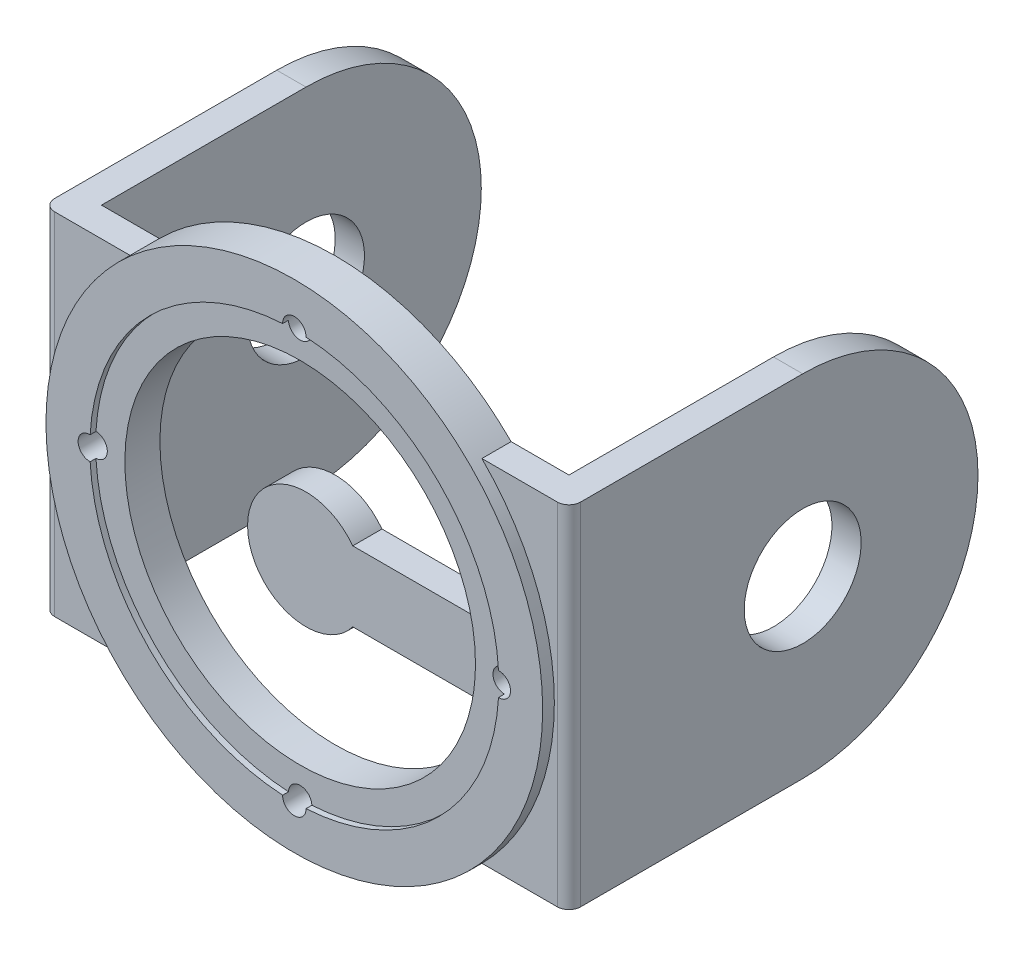
ISO-10303-21;
HEADER;
FILE_DESCRIPTION(('STEP AP214'),'2;1');
FILE_NAME('part.step','',(''),(''),'','','');
FILE_SCHEMA(('AUTOMOTIVE_DESIGN { 1 0 10303 214 1 1 1 1 }'));
ENDSEC;
DATA;
#1=APPLICATION_CONTEXT('core data for automotive mechanical design processes');
#2=APPLICATION_PROTOCOL_DEFINITION('international standard','automotive_design',2000,#1);
#3=PRODUCT_CONTEXT('',#1,'mechanical');
#4=PRODUCT('Part','Part','',(#3));
#5=PRODUCT_RELATED_PRODUCT_CATEGORY('part','',(#4));
#6=PRODUCT_DEFINITION_FORMATION('','',#4);
#7=PRODUCT_DEFINITION_CONTEXT('part definition',#1,'design');
#8=PRODUCT_DEFINITION('design','',#6,#7);
#9=PRODUCT_DEFINITION_SHAPE('','',#8);
#10=(LENGTH_UNIT() NAMED_UNIT(*) SI_UNIT(.MILLI.,.METRE.));
#11=(NAMED_UNIT(*) PLANE_ANGLE_UNIT() SI_UNIT($,.RADIAN.));
#12=(NAMED_UNIT(*) SI_UNIT($,.STERADIAN.) SOLID_ANGLE_UNIT());
#13=UNCERTAINTY_MEASURE_WITH_UNIT(LENGTH_MEASURE(1.E-05),#10,'distance_accuracy_value','');
#14=(GEOMETRIC_REPRESENTATION_CONTEXT(3) GLOBAL_UNCERTAINTY_ASSIGNED_CONTEXT((#13)) GLOBAL_UNIT_ASSIGNED_CONTEXT((#10,
#11,#12)) REPRESENTATION_CONTEXT('',''));
#15=CARTESIAN_POINT('',(0.,0.,0.));
#16=DIRECTION('',(0.,0.,1.));
#17=DIRECTION('',(1.,0.,0.));
#18=AXIS2_PLACEMENT_3D('',#15,#16,#17);
#19=CARTESIAN_POINT('',(0.,0.,7.));
#20=DIRECTION('',(0.,0.,-1.));
#21=DIRECTION('',(-1.,0.,0.));
#22=AXIS2_PLACEMENT_3D('',#19,#20,#21);
#23=CYLINDRICAL_SURFACE('',#22,35.);
#24=DIRECTION('',(0.,0.,-1.));
#25=VECTOR('',#24,1.);
#26=CARTESIAN_POINT('',(34.9428571428571,-1.99918350680512,3.5));
#27=LINE('',#26,#25);
#28=CARTESIAN_POINT('',(34.9428571428571,-1.99918350680511,6.));
#29=VERTEX_POINT('',#28);
#30=CARTESIAN_POINT('',(34.9428571428571,-1.99918350680512,7.));
#31=VERTEX_POINT('',#30);
#32=EDGE_CURVE('E401',#29,#31,#27,.F.);
#33=ORIENTED_EDGE('',*,*,#32,.F.);
#34=CARTESIAN_POINT('',(0.,0.,6.));
#35=DIRECTION('',(0.,0.,1.));
#36=DIRECTION('',(1.,0.,0.));
#37=AXIS2_PLACEMENT_3D('',#34,#35,#36);
#38=CIRCLE('',#37,35.);
#39=CARTESIAN_POINT('',(1.99918350680212,-34.9428571428573,6.));
#40=VERTEX_POINT('',#39);
#41=EDGE_CURVE('E338',#29,#40,#38,.F.);
#42=ORIENTED_EDGE('',*,*,#41,.T.);
#43=DIRECTION('',(0.,0.,-1.));
#44=VECTOR('',#43,1.);
#45=CARTESIAN_POINT('',(1.99918350680213,-34.9428571428573,3.5));
#46=LINE('',#45,#44);
#47=CARTESIAN_POINT('',(1.99918350680213,-34.9428571428573,7.));
#48=VERTEX_POINT('',#47);
#49=EDGE_CURVE('E394',#48,#40,#46,.T.);
#50=ORIENTED_EDGE('',*,*,#49,.F.);
#51=CARTESIAN_POINT('',(0.,0.,7.));
#52=DIRECTION('',(0.,0.,1.));
#53=DIRECTION('',(1.,0.,0.));
#54=AXIS2_PLACEMENT_3D('',#51,#52,#53);
#55=CIRCLE('',#54,35.);
#56=EDGE_CURVE('E549',#48,#31,#55,.T.);
#57=ORIENTED_EDGE('',*,*,#56,.T.);
#58=EDGE_LOOP('',(#33,#42,#50,#57));
#59=FACE_BOUND('',#58,.T.);
#60=ADVANCED_FACE('F33',(#59),#23,.F.);
#61=DIRECTION('',(0.,0.,-1.));
#62=VECTOR('',#61,1.);
#63=CARTESIAN_POINT('',(-1.99918350680608,-34.942857142857,3.5));
#64=LINE('',#63,#62);
#65=CARTESIAN_POINT('',(-1.99918350680609,-34.942857142857,6.));
#66=VERTEX_POINT('',#65);
#67=CARTESIAN_POINT('',(-1.99918350680608,-34.942857142857,7.));
#68=VERTEX_POINT('',#67);
#69=EDGE_CURVE('E397',#66,#68,#64,.F.);
#70=ORIENTED_EDGE('',*,*,#69,.F.);
#71=CARTESIAN_POINT('',(-34.9428571428572,-1.99918350680309,6.));
#72=VERTEX_POINT('',#71);
#73=EDGE_CURVE('E536',#66,#72,#38,.F.);
#74=ORIENTED_EDGE('',*,*,#73,.T.);
#75=DIRECTION('',(0.,0.,-1.));
#76=VECTOR('',#75,1.);
#77=CARTESIAN_POINT('',(-34.9428571428572,-1.99918350680309,3.5));
#78=LINE('',#77,#76);
#79=CARTESIAN_POINT('',(-34.9428571428572,-1.99918350680309,7.));
#80=VERTEX_POINT('',#79);
#81=EDGE_CURVE('E389',#80,#72,#78,.T.);
#82=ORIENTED_EDGE('',*,*,#81,.F.);
#83=EDGE_CURVE('E326',#80,#68,#55,.T.);
#84=ORIENTED_EDGE('',*,*,#83,.T.);
#85=EDGE_LOOP('',(#70,#74,#82,#84));
#86=FACE_BOUND('',#85,.T.);
#87=ADVANCED_FACE('F493',(#86),#23,.F.);
#88=DIRECTION('',(0.,0.,-1.));
#89=VECTOR('',#88,1.);
#90=CARTESIAN_POINT('',(-34.9428571428571,1.99918350680507,3.5));
#91=LINE('',#90,#89);
#92=CARTESIAN_POINT('',(-34.9428571428571,1.9991835068051,6.));
#93=VERTEX_POINT('',#92);
#94=CARTESIAN_POINT('',(-34.9428571428571,1.99918350680507,7.));
#95=VERTEX_POINT('',#94);
#96=EDGE_CURVE('E392',#93,#95,#91,.F.);
#97=ORIENTED_EDGE('',*,*,#96,.F.);
#98=CARTESIAN_POINT('',(-1.9991835068041,34.9428571428572,6.));
#99=VERTEX_POINT('',#98);
#100=EDGE_CURVE('E330',#93,#99,#38,.F.);
#101=ORIENTED_EDGE('',*,*,#100,.T.);
#102=DIRECTION('',(0.,0.,-1.));
#103=VECTOR('',#102,1.);
#104=CARTESIAN_POINT('',(-1.99918350680411,34.9428571428572,3.5));
#105=LINE('',#104,#103);
#106=CARTESIAN_POINT('',(-1.99918350680411,34.9428571428572,7.));
#107=VERTEX_POINT('',#106);
#108=EDGE_CURVE('E383',#107,#99,#105,.T.);
#109=ORIENTED_EDGE('',*,*,#108,.F.);
#110=EDGE_CURVE('E322',#107,#95,#55,.T.);
#111=ORIENTED_EDGE('',*,*,#110,.T.);
#112=EDGE_LOOP('',(#97,#101,#109,#111));
#113=FACE_BOUND('',#112,.T.);
#114=ADVANCED_FACE('F500',(#113),#23,.F.);
#115=CARTESIAN_POINT('',(0.,0.,5.));
#116=DIRECTION('',(0.,0.,1.));
#117=DIRECTION('',(1.,0.,0.));
#118=AXIS2_PLACEMENT_3D('',#115,#116,#117);
#119=PLANE('',#118);
#120=DIRECTION('',(-1.,0.,0.));
#121=VECTOR('',#120,1.);
#122=CARTESIAN_POINT('',(-30.1039864469808,30.,5.));
#123=LINE('',#122,#121);
#124=CARTESIAN_POINT('',(-30.1039864469808,30.,5.));
#125=VERTEX_POINT('',#124);
#126=CARTESIAN_POINT('',(-43.,30.,5.));
#127=VERTEX_POINT('',#126);
#128=EDGE_CURVE('E344',#125,#127,#123,.T.);
#129=ORIENTED_EDGE('',*,*,#128,.T.);
#130=DIRECTION('',(0.,1.,0.));
#131=VECTOR('',#130,1.);
#132=CARTESIAN_POINT('',(-43.,0.,5.));
#133=LINE('',#132,#131);
#134=CARTESIAN_POINT('',(-43.,-30.,5.));
#135=VERTEX_POINT('',#134);
#136=EDGE_CURVE('E408',#127,#135,#133,.F.);
#137=ORIENTED_EDGE('',*,*,#136,.T.);
#138=DIRECTION('',(1.,0.,0.));
#139=VECTOR('',#138,1.);
#140=CARTESIAN_POINT('',(-30.1039864469807,-30.,5.));
#141=LINE('',#140,#139);
#142=CARTESIAN_POINT('',(-30.1039864469807,-30.,5.));
#143=VERTEX_POINT('',#142);
#144=EDGE_CURVE('E347',#135,#143,#141,.T.);
#145=ORIENTED_EDGE('',*,*,#144,.T.);
#146=CARTESIAN_POINT('',(0.,0.,5.));
#147=DIRECTION('',(0.,0.,1.));
#148=DIRECTION('',(1.,0.,0.));
#149=AXIS2_PLACEMENT_3D('',#146,#147,#148);
#150=CIRCLE('',#149,42.5);
#151=EDGE_CURVE('E325',#125,#143,#150,.T.);
#152=ORIENTED_EDGE('',*,*,#151,.F.);
#153=EDGE_LOOP('',(#129,#137,#145,#152));
#154=FACE_BOUND('',#153,.T.);
#155=ADVANCED_FACE('F458',(#154),#119,.T.);
#156=DIRECTION('',(1.,0.,0.));
#157=VECTOR('',#156,1.);
#158=CARTESIAN_POINT('',(40.,-30.,5.));
#159=LINE('',#158,#157);
#160=CARTESIAN_POINT('',(30.1039864469807,-30.,5.));
#161=VERTEX_POINT('',#160);
#162=CARTESIAN_POINT('',(43.,-30.,5.));
#163=VERTEX_POINT('',#162);
#164=EDGE_CURVE('E350',#161,#163,#159,.T.);
#165=ORIENTED_EDGE('',*,*,#164,.T.);
#166=DIRECTION('',(0.,1.,0.));
#167=VECTOR('',#166,1.);
#168=CARTESIAN_POINT('',(43.,0.,5.));
#169=LINE('',#168,#167);
#170=CARTESIAN_POINT('',(43.,30.,5.));
#171=VERTEX_POINT('',#170);
#172=EDGE_CURVE('E412',#163,#171,#169,.T.);
#173=ORIENTED_EDGE('',*,*,#172,.T.);
#174=DIRECTION('',(-1.,0.,0.));
#175=VECTOR('',#174,1.);
#176=CARTESIAN_POINT('',(40.,30.,5.));
#177=LINE('',#176,#175);
#178=CARTESIAN_POINT('',(30.1039864469807,30.,5.));
#179=VERTEX_POINT('',#178);
#180=EDGE_CURVE('E353',#171,#179,#177,.T.);
#181=ORIENTED_EDGE('',*,*,#180,.T.);
#182=EDGE_CURVE('E331',#161,#179,#150,.T.);
#183=ORIENTED_EDGE('',*,*,#182,.F.);
#184=EDGE_LOOP('',(#165,#173,#181,#183));
#185=FACE_BOUND('',#184,.T.);
#186=ADVANCED_FACE('F432',(#185),#119,.T.);
#187=CARTESIAN_POINT('',(0.,0.,0.));
#188=DIRECTION('',(0.,0.,1.));
#189=DIRECTION('',(1.,0.,0.));
#190=AXIS2_PLACEMENT_3D('',#187,#188,#189);
#191=PLANE('',#190);
#192=DIRECTION('',(1.,0.,0.));
#193=VECTOR('',#192,1.);
#194=CARTESIAN_POINT('',(8.,6.,0.));
#195=LINE('',#194,#193);
#196=CARTESIAN_POINT('',(8.,6.,0.));
#197=VERTEX_POINT('',#196);
#198=CARTESIAN_POINT('',(29.3938769133981,5.99999999999999,0.));
#199=VERTEX_POINT('',#198);
#200=EDGE_CURVE('E48',#197,#199,#195,.T.);
#201=ORIENTED_EDGE('',*,*,#200,.T.);
#202=CARTESIAN_POINT('',(0.,0.,0.));
#203=DIRECTION('',(0.,0.,1.));
#204=DIRECTION('',(1.,0.,0.));
#205=AXIS2_PLACEMENT_3D('',#202,#203,#204);
#206=CIRCLE('',#205,30.);
#207=CARTESIAN_POINT('',(29.3938769133981,-5.99999999999999,0.));
#208=VERTEX_POINT('',#207);
#209=EDGE_CURVE('E341',#199,#208,#206,.T.);
#210=ORIENTED_EDGE('',*,*,#209,.T.);
#211=DIRECTION('',(-1.,0.,0.));
#212=VECTOR('',#211,1.);
#213=CARTESIAN_POINT('',(8.,-6.,0.));
#214=LINE('',#213,#212);
#215=CARTESIAN_POINT('',(8.,-5.99999999999999,0.));
#216=VERTEX_POINT('',#215);
#217=EDGE_CURVE('E233',#208,#216,#214,.T.);
#218=ORIENTED_EDGE('',*,*,#217,.T.);
#219=CARTESIAN_POINT('',(0.,0.,0.));
#220=DIRECTION('',(0.,0.,-1.));
#221=DIRECTION('',(-1.,0.,0.));
#222=AXIS2_PLACEMENT_3D('',#219,#220,#221);
#223=CIRCLE('',#222,10.);
#224=EDGE_CURVE('E224',#216,#197,#223,.T.);
#225=ORIENTED_EDGE('',*,*,#224,.T.);
#226=EDGE_LOOP('',(#201,#210,#218,#225));
#227=FACE_BOUND('',#226,.T.);
#228=CARTESIAN_POINT('',(34.999999999999,-9.94453668364353E-13,0.));
#229=DIRECTION('',(0.,0.,-1.));
#230=DIRECTION('',(-1.,0.,0.));
#231=AXIS2_PLACEMENT_3D('',#228,#229,#230);
#232=CIRCLE('',#231,2.);
#233=CARTESIAN_POINT('',(32.999999999999,-9.94453668364353E-13,0.));
#234=VERTEX_POINT('',#233);
#235=EDGE_CURVE('E289',#234,#234,#232,.T.);
#236=ORIENTED_EDGE('',*,*,#235,.F.);
#237=EDGE_LOOP('',(#236));
#238=FACE_BOUND('',#237,.T.);
#239=CARTESIAN_POINT('',(-1.98125329423404E-12,-35.,0.));
#240=DIRECTION('',(0.,0.,-1.));
#241=DIRECTION('',(-1.,0.,0.));
#242=AXIS2_PLACEMENT_3D('',#239,#240,#241);
#243=CIRCLE('',#242,2.);
#244=CARTESIAN_POINT('',(-2.00000000000198,-35.,0.));
#245=VERTEX_POINT('',#244);
#246=EDGE_CURVE('E297',#245,#245,#243,.T.);
#247=ORIENTED_EDGE('',*,*,#246,.F.);
#248=EDGE_LOOP('',(#247));
#249=FACE_BOUND('',#248,.T.);
#250=CARTESIAN_POINT('',(-35.000000000001,9.90167404567338E-13,0.));
#251=DIRECTION('',(0.,0.,-1.));
#252=DIRECTION('',(-1.,0.,0.));
#253=AXIS2_PLACEMENT_3D('',#250,#251,#252);
#254=CIRCLE('',#253,2.);
#255=CARTESIAN_POINT('',(-37.000000000001,9.90167404567338E-13,0.));
#256=VERTEX_POINT('',#255);
#257=EDGE_CURVE('E305',#256,#256,#254,.T.);
#258=ORIENTED_EDGE('',*,*,#257,.F.);
#259=EDGE_LOOP('',(#258));
#260=FACE_BOUND('',#259,.T.);
#261=CARTESIAN_POINT('',(0.,35.,0.));
#262=DIRECTION('',(0.,0.,-1.));
#263=DIRECTION('',(-1.,0.,0.));
#264=AXIS2_PLACEMENT_3D('',#261,#262,#263);
#265=CIRCLE('',#264,2.);
#266=CARTESIAN_POINT('',(-2.,35.,0.));
#267=VERTEX_POINT('',#266);
#268=EDGE_CURVE('E313',#267,#267,#265,.T.);
#269=ORIENTED_EDGE('',*,*,#268,.F.);
#270=EDGE_LOOP('',(#269));
#271=FACE_BOUND('',#270,.T.);
#272=DIRECTION('',(-1.,0.,0.));
#273=VECTOR('',#272,1.);
#274=CARTESIAN_POINT('',(-30.1039864469808,30.,0.));
#275=LINE('',#274,#273);
#276=CARTESIAN_POINT('',(-30.1039864469808,30.,0.));
#277=VERTEX_POINT('',#276);
#278=CARTESIAN_POINT('',(-40.,30.,0.));
#279=VERTEX_POINT('',#278);
#280=EDGE_CURVE('E343',#277,#279,#275,.T.);
#281=ORIENTED_EDGE('',*,*,#280,.F.);
#282=CARTESIAN_POINT('',(0.,0.,0.));
#283=DIRECTION('',(0.,0.,1.));
#284=DIRECTION('',(1.,0.,0.));
#285=AXIS2_PLACEMENT_3D('',#282,#283,#284);
#286=CIRCLE('',#285,42.5);
#287=CARTESIAN_POINT('',(30.1039864469807,30.,0.));
#288=VERTEX_POINT('',#287);
#289=EDGE_CURVE('E348',#288,#277,#286,.T.);
#290=ORIENTED_EDGE('',*,*,#289,.F.);
#291=DIRECTION('',(-1.,0.,0.));
#292=VECTOR('',#291,1.);
#293=CARTESIAN_POINT('',(40.,30.,0.));
#294=LINE('',#293,#292);
#295=CARTESIAN_POINT('',(40.,30.,0.));
#296=VERTEX_POINT('',#295);
#297=EDGE_CURVE('E369',#296,#288,#294,.T.);
#298=ORIENTED_EDGE('',*,*,#297,.F.);
#299=DIRECTION('',(0.,1.,0.));
#300=VECTOR('',#299,1.);
#301=CARTESIAN_POINT('',(40.,-30.,0.));
#302=LINE('',#301,#300);
#303=CARTESIAN_POINT('',(40.,-30.,0.));
#304=VERTEX_POINT('',#303);
#305=EDGE_CURVE('E367',#304,#296,#302,.T.);
#306=ORIENTED_EDGE('',*,*,#305,.F.);
#307=DIRECTION('',(1.,0.,0.));
#308=VECTOR('',#307,1.);
#309=CARTESIAN_POINT('',(40.,-30.,0.));
#310=LINE('',#309,#308);
#311=CARTESIAN_POINT('',(30.1039864469807,-30.,0.));
#312=VERTEX_POINT('',#311);
#313=EDGE_CURVE('E364',#312,#304,#310,.T.);
#314=ORIENTED_EDGE('',*,*,#313,.F.);
#315=CARTESIAN_POINT('',(0.,0.,0.));
#316=DIRECTION('',(0.,0.,1.));
#317=DIRECTION('',(1.,0.,0.));
#318=AXIS2_PLACEMENT_3D('',#315,#316,#317);
#319=CIRCLE('',#318,42.5);
#320=CARTESIAN_POINT('',(-30.1039864469807,-30.,0.));
#321=VERTEX_POINT('',#320);
#322=EDGE_CURVE('E362',#321,#312,#319,.T.);
#323=ORIENTED_EDGE('',*,*,#322,.F.);
#324=DIRECTION('',(1.,0.,0.));
#325=VECTOR('',#324,1.);
#326=CARTESIAN_POINT('',(-30.1039864469807,-30.,0.));
#327=LINE('',#326,#325);
#328=CARTESIAN_POINT('',(-40.,-30.,0.));
#329=VERTEX_POINT('',#328);
#330=EDGE_CURVE('E360',#329,#321,#327,.T.);
#331=ORIENTED_EDGE('',*,*,#330,.F.);
#332=DIRECTION('',(0.,-1.,0.));
#333=VECTOR('',#332,1.);
#334=CARTESIAN_POINT('',(-40.,-30.,0.));
#335=LINE('',#334,#333);
#336=EDGE_CURVE('E358',#279,#329,#335,.T.);
#337=ORIENTED_EDGE('',*,*,#336,.F.);
#338=EDGE_LOOP('',(#281,#290,#298,#306,#314,#323,#331,#337));
#339=FACE_BOUND('',#338,.T.);
#340=ADVANCED_FACE('F428',(#227,#238,#249,#260,#271,#339),#191,.F.);
#341=CARTESIAN_POINT('',(-30.1039864469808,30.,5.));
#342=DIRECTION('',(0.,-1.,0.));
#343=DIRECTION('',(1.,0.,0.));
#344=AXIS2_PLACEMENT_3D('',#341,#342,#343);
#345=PLANE('',#344);
#346=DIRECTION('',(0.,0.,-1.));
#347=VECTOR('',#346,1.);
#348=CARTESIAN_POINT('',(-45.,30.,5.));
#349=LINE('',#348,#347);
#350=CARTESIAN_POINT('',(-45.,30.,3.));
#351=VERTEX_POINT('',#350);
#352=CARTESIAN_POINT('',(-45.,30.,-35.));
#353=VERTEX_POINT('',#352);
#354=EDGE_CURVE('E270',#351,#353,#349,.T.);
#355=ORIENTED_EDGE('',*,*,#354,.F.);
#356=CARTESIAN_POINT('',(-43.,30.,3.));
#357=DIRECTION('',(0.,-1.,0.));
#358=DIRECTION('',(1.,0.,0.));
#359=AXIS2_PLACEMENT_3D('',#356,#357,#358);
#360=CIRCLE('',#359,2.);
#361=EDGE_CURVE('E406',#351,#127,#360,.F.);
#362=ORIENTED_EDGE('',*,*,#361,.T.);
#363=ORIENTED_EDGE('',*,*,#128,.F.);
#364=DIRECTION('',(0.,0.,-1.));
#365=VECTOR('',#364,1.);
#366=CARTESIAN_POINT('',(-30.1039864469808,30.,5.));
#367=LINE('',#366,#365);
#368=EDGE_CURVE('E355',#125,#277,#367,.T.);
#369=ORIENTED_EDGE('',*,*,#368,.T.);
#370=ORIENTED_EDGE('',*,*,#280,.T.);
#371=DIRECTION('',(0.,0.,-1.));
#372=VECTOR('',#371,1.);
#373=CARTESIAN_POINT('',(-40.,30.,5.));
#374=LINE('',#373,#372);
#375=CARTESIAN_POINT('',(-40.,30.,-35.));
#376=VERTEX_POINT('',#375);
#377=EDGE_CURVE('E267',#279,#376,#374,.T.);
#378=ORIENTED_EDGE('',*,*,#377,.T.);
#379=DIRECTION('',(1.,0.,0.));
#380=VECTOR('',#379,1.);
#381=CARTESIAN_POINT('',(-45.,30.,-35.));
#382=LINE('',#381,#380);
#383=EDGE_CURVE('E286',#353,#376,#382,.T.);
#384=ORIENTED_EDGE('',*,*,#383,.F.);
#385=EDGE_LOOP('',(#355,#362,#363,#369,#370,#378,#384));
#386=FACE_BOUND('',#385,.T.);
#387=ADVANCED_FACE('F431',(#386),#345,.F.);
#388=CARTESIAN_POINT('',(-30.1039864469807,-30.,5.));
#389=DIRECTION('',(0.,1.,0.));
#390=DIRECTION('',(-1.,0.,0.));
#391=AXIS2_PLACEMENT_3D('',#388,#389,#390);
#392=PLANE('',#391);
#393=ORIENTED_EDGE('',*,*,#144,.F.);
#394=CARTESIAN_POINT('',(-43.,-30.,3.));
#395=DIRECTION('',(0.,1.,0.));
#396=DIRECTION('',(-1.,0.,0.));
#397=AXIS2_PLACEMENT_3D('',#394,#395,#396);
#398=CIRCLE('',#397,2.);
#399=CARTESIAN_POINT('',(-45.,-30.,3.));
#400=VERTEX_POINT('',#399);
#401=EDGE_CURVE('E410',#135,#400,#398,.F.);
#402=ORIENTED_EDGE('',*,*,#401,.T.);
#403=DIRECTION('',(0.,0.,1.));
#404=VECTOR('',#403,1.);
#405=CARTESIAN_POINT('',(-45.,-30.,5.));
#406=LINE('',#405,#404);
#407=CARTESIAN_POINT('',(-45.,-30.,-35.));
#408=VERTEX_POINT('',#407);
#409=EDGE_CURVE('E275',#408,#400,#406,.T.);
#410=ORIENTED_EDGE('',*,*,#409,.F.);
#411=DIRECTION('',(1.,0.,0.));
#412=VECTOR('',#411,1.);
#413=CARTESIAN_POINT('',(-45.,-30.,-35.));
#414=LINE('',#413,#412);
#415=CARTESIAN_POINT('',(-40.,-30.,-35.));
#416=VERTEX_POINT('',#415);
#417=EDGE_CURVE('E278',#408,#416,#414,.T.);
#418=ORIENTED_EDGE('',*,*,#417,.T.);
#419=DIRECTION('',(0.,0.,1.));
#420=VECTOR('',#419,1.);
#421=CARTESIAN_POINT('',(-40.,-30.,5.));
#422=LINE('',#421,#420);
#423=EDGE_CURVE('E273',#416,#329,#422,.T.);
#424=ORIENTED_EDGE('',*,*,#423,.T.);
#425=ORIENTED_EDGE('',*,*,#330,.T.);
#426=DIRECTION('',(0.,0.,-1.));
#427=VECTOR('',#426,1.);
#428=CARTESIAN_POINT('',(-30.1039864469807,-30.,5.));
#429=LINE('',#428,#427);
#430=EDGE_CURVE('E380',#143,#321,#429,.T.);
#431=ORIENTED_EDGE('',*,*,#430,.F.);
#432=EDGE_LOOP('',(#393,#402,#410,#418,#424,#425,#431));
#433=FACE_BOUND('',#432,.T.);
#434=ADVANCED_FACE('F463',(#433),#392,.F.);
#435=CARTESIAN_POINT('',(40.,-30.,5.));
#436=DIRECTION('',(0.,1.,0.));
#437=DIRECTION('',(0.,0.,1.));
#438=AXIS2_PLACEMENT_3D('',#435,#436,#437);
#439=PLANE('',#438);
#440=DIRECTION('',(0.,0.,1.));
#441=VECTOR('',#440,1.);
#442=CARTESIAN_POINT('',(45.,-30.,5.));
#443=LINE('',#442,#441);
#444=CARTESIAN_POINT('',(45.,-30.,-35.));
#445=VERTEX_POINT('',#444);
#446=CARTESIAN_POINT('',(45.,-30.,3.));
#447=VERTEX_POINT('',#446);
#448=EDGE_CURVE('E245',#445,#447,#443,.T.);
#449=ORIENTED_EDGE('',*,*,#448,.T.);
#450=CARTESIAN_POINT('',(43.,-30.,3.));
#451=DIRECTION('',(0.,1.,0.));
#452=DIRECTION('',(0.,0.,1.));
#453=AXIS2_PLACEMENT_3D('',#450,#451,#452);
#454=CIRCLE('',#453,2.);
#455=EDGE_CURVE('E418',#447,#163,#454,.F.);
#456=ORIENTED_EDGE('',*,*,#455,.T.);
#457=ORIENTED_EDGE('',*,*,#164,.F.);
#458=DIRECTION('',(0.,0.,-1.));
#459=VECTOR('',#458,1.);
#460=CARTESIAN_POINT('',(30.1039864469807,-30.,5.));
#461=LINE('',#460,#459);
#462=EDGE_CURVE('E377',#161,#312,#461,.T.);
#463=ORIENTED_EDGE('',*,*,#462,.T.);
#464=ORIENTED_EDGE('',*,*,#313,.T.);
#465=DIRECTION('',(0.,0.,1.));
#466=VECTOR('',#465,1.);
#467=CARTESIAN_POINT('',(40.,-30.,5.));
#468=LINE('',#467,#466);
#469=CARTESIAN_POINT('',(40.,-30.,-35.));
#470=VERTEX_POINT('',#469);
#471=EDGE_CURVE('E242',#470,#304,#468,.T.);
#472=ORIENTED_EDGE('',*,*,#471,.F.);
#473=DIRECTION('',(-1.,0.,0.));
#474=VECTOR('',#473,1.);
#475=CARTESIAN_POINT('',(45.,-30.,-35.));
#476=LINE('',#475,#474);
#477=EDGE_CURVE('E261',#445,#470,#476,.T.);
#478=ORIENTED_EDGE('',*,*,#477,.F.);
#479=EDGE_LOOP('',(#449,#456,#457,#463,#464,#472,#478));
#480=FACE_BOUND('',#479,.T.);
#481=ADVANCED_FACE('F605',(#480),#439,.F.);
#482=CARTESIAN_POINT('',(40.,30.,5.));
#483=DIRECTION('',(0.,-1.,0.));
#484=DIRECTION('',(1.,0.,0.));
#485=AXIS2_PLACEMENT_3D('',#482,#483,#484);
#486=PLANE('',#485);
#487=ORIENTED_EDGE('',*,*,#180,.F.);
#488=CARTESIAN_POINT('',(43.,30.,3.));
#489=DIRECTION('',(0.,-1.,0.));
#490=DIRECTION('',(1.,0.,0.));
#491=AXIS2_PLACEMENT_3D('',#488,#489,#490);
#492=CIRCLE('',#491,2.);
#493=CARTESIAN_POINT('',(45.,30.,3.));
#494=VERTEX_POINT('',#493);
#495=EDGE_CURVE('E415',#171,#494,#492,.F.);
#496=ORIENTED_EDGE('',*,*,#495,.T.);
#497=DIRECTION('',(0.,0.,-1.));
#498=VECTOR('',#497,1.);
#499=CARTESIAN_POINT('',(45.,30.,5.));
#500=LINE('',#499,#498);
#501=CARTESIAN_POINT('',(45.,30.,-35.));
#502=VERTEX_POINT('',#501);
#503=EDGE_CURVE('E251',#494,#502,#500,.T.);
#504=ORIENTED_EDGE('',*,*,#503,.T.);
#505=DIRECTION('',(-1.,0.,0.));
#506=VECTOR('',#505,1.);
#507=CARTESIAN_POINT('',(45.,30.,-35.));
#508=LINE('',#507,#506);
#509=CARTESIAN_POINT('',(40.,30.,-35.));
#510=VERTEX_POINT('',#509);
#511=EDGE_CURVE('E253',#502,#510,#508,.T.);
#512=ORIENTED_EDGE('',*,*,#511,.T.);
#513=DIRECTION('',(0.,0.,-1.));
#514=VECTOR('',#513,1.);
#515=CARTESIAN_POINT('',(40.,30.,5.));
#516=LINE('',#515,#514);
#517=EDGE_CURVE('E248',#296,#510,#516,.T.);
#518=ORIENTED_EDGE('',*,*,#517,.F.);
#519=ORIENTED_EDGE('',*,*,#297,.T.);
#520=DIRECTION('',(0.,0.,-1.));
#521=VECTOR('',#520,1.);
#522=CARTESIAN_POINT('',(30.1039864469807,30.,5.));
#523=LINE('',#522,#521);
#524=EDGE_CURVE('E374',#179,#288,#523,.T.);
#525=ORIENTED_EDGE('',*,*,#524,.F.);
#526=EDGE_LOOP('',(#487,#496,#504,#512,#518,#519,#525));
#527=FACE_BOUND('',#526,.T.);
#528=ADVANCED_FACE('F617',(#527),#486,.F.);
#529=CARTESIAN_POINT('',(0.,0.,5.));
#530=DIRECTION('',(0.,0.,-1.));
#531=DIRECTION('',(-1.,0.,0.));
#532=AXIS2_PLACEMENT_3D('',#529,#530,#531);
#533=CYLINDRICAL_SURFACE('',#532,42.5);
#534=ORIENTED_EDGE('',*,*,#289,.T.);
#535=ORIENTED_EDGE('',*,*,#368,.F.);
#536=ORIENTED_EDGE('',*,*,#151,.T.);
#537=ORIENTED_EDGE('',*,*,#430,.T.);
#538=ORIENTED_EDGE('',*,*,#322,.T.);
#539=ORIENTED_EDGE('',*,*,#462,.F.);
#540=ORIENTED_EDGE('',*,*,#182,.T.);
#541=ORIENTED_EDGE('',*,*,#524,.T.);
#542=EDGE_LOOP('',(#534,#535,#536,#537,#538,#539,#540,#541));
#543=FACE_BOUND('',#542,.T.);
#544=CARTESIAN_POINT('',(0.,0.,7.));
#545=DIRECTION('',(0.,0.,1.));
#546=DIRECTION('',(1.,0.,0.));
#547=AXIS2_PLACEMENT_3D('',#544,#545,#546);
#548=CIRCLE('',#547,42.5);
#549=CARTESIAN_POINT('',(42.5,0.,7.));
#550=VERTEX_POINT('',#549);
#551=EDGE_CURVE('E327',#550,#550,#548,.T.);
#552=ORIENTED_EDGE('',*,*,#551,.F.);
#553=EDGE_LOOP('',(#552));
#554=FACE_BOUND('',#553,.T.);
#555=ADVANCED_FACE('F454',(#543,#554),#533,.T.);
#556=CARTESIAN_POINT('',(0.,0.,5.));
#557=DIRECTION('',(0.,0.,-1.));
#558=DIRECTION('',(-1.,0.,0.));
#559=AXIS2_PLACEMENT_3D('',#556,#557,#558);
#560=CYLINDRICAL_SURFACE('',#559,30.);
#561=DIRECTION('',(0.,0.,-1.));
#562=VECTOR('',#561,1.);
#563=CARTESIAN_POINT('',(29.3938769133981,5.99999999999999,5.));
#564=LINE('',#563,#562);
#565=CARTESIAN_POINT('',(29.3938769133981,5.99999999999999,5.));
#566=VERTEX_POINT('',#565);
#567=EDGE_CURVE('E11',#566,#199,#564,.T.);
#568=ORIENTED_EDGE('',*,*,#567,.F.);
#569=CARTESIAN_POINT('',(0.,0.,5.));
#570=DIRECTION('',(0.,0.,-1.));
#571=DIRECTION('',(-1.,0.,0.));
#572=AXIS2_PLACEMENT_3D('',#569,#570,#571);
#573=CIRCLE('',#572,30.);
#574=CARTESIAN_POINT('',(29.3938769133981,-5.99999999999999,5.));
#575=VERTEX_POINT('',#574);
#576=EDGE_CURVE('E420',#566,#575,#573,.T.);
#577=ORIENTED_EDGE('',*,*,#576,.T.);
#578=DIRECTION('',(0.,0.,-1.));
#579=VECTOR('',#578,1.);
#580=CARTESIAN_POINT('',(29.3938769133981,-5.99999999999999,5.));
#581=LINE('',#580,#579);
#582=EDGE_CURVE('E41',#208,#575,#581,.F.);
#583=ORIENTED_EDGE('',*,*,#582,.F.);
#584=ORIENTED_EDGE('',*,*,#209,.F.);
#585=EDGE_LOOP('',(#568,#577,#583,#584));
#586=FACE_BOUND('',#585,.T.);
#587=CARTESIAN_POINT('',(0.,0.,6.));
#588=DIRECTION('',(0.,0.,1.));
#589=DIRECTION('',(1.,0.,0.));
#590=AXIS2_PLACEMENT_3D('',#587,#588,#589);
#591=CIRCLE('',#590,30.);
#592=CARTESIAN_POINT('',(30.,0.,6.));
#593=VERTEX_POINT('',#592);
#594=EDGE_CURVE('E337',#593,#593,#591,.T.);
#595=ORIENTED_EDGE('',*,*,#594,.T.);
#596=EDGE_LOOP('',(#595));
#597=FACE_BOUND('',#596,.T.);
#598=ADVANCED_FACE('F423',(#586,#597),#560,.F.);
#599=CARTESIAN_POINT('',(0.,0.,6.));
#600=DIRECTION('',(0.,0.,1.));
#601=DIRECTION('',(1.,0.,0.));
#602=AXIS2_PLACEMENT_3D('',#599,#600,#601);
#603=PLANE('',#602);
#604=CARTESIAN_POINT('',(34.999999999999,-9.94453668364353E-13,6.));
#605=DIRECTION('',(0.,0.,1.));
#606=DIRECTION('',(1.,0.,0.));
#607=AXIS2_PLACEMENT_3D('',#604,#605,#606);
#608=CIRCLE('',#607,2.);
#609=CARTESIAN_POINT('',(34.9428571428572,1.99918350680313,6.));
#610=VERTEX_POINT('',#609);
#611=EDGE_CURVE('E293',#610,#29,#608,.T.);
#612=ORIENTED_EDGE('',*,*,#611,.F.);
#613=CARTESIAN_POINT('',(1.99918350680411,34.9428571428572,6.));
#614=VERTEX_POINT('',#613);
#615=EDGE_CURVE('E334',#614,#610,#38,.F.);
#616=ORIENTED_EDGE('',*,*,#615,.F.);
#617=CARTESIAN_POINT('',(0.,35.,6.));
#618=DIRECTION('',(0.,0.,1.));
#619=DIRECTION('',(1.,0.,0.));
#620=AXIS2_PLACEMENT_3D('',#617,#618,#619);
#621=CIRCLE('',#620,2.);
#622=EDGE_CURVE('E317',#99,#614,#621,.T.);
#623=ORIENTED_EDGE('',*,*,#622,.F.);
#624=ORIENTED_EDGE('',*,*,#100,.F.);
#625=CARTESIAN_POINT('',(-35.000000000001,9.90167404567338E-13,6.));
#626=DIRECTION('',(0.,0.,1.));
#627=DIRECTION('',(1.,0.,0.));
#628=AXIS2_PLACEMENT_3D('',#625,#626,#627);
#629=CIRCLE('',#628,2.);
#630=EDGE_CURVE('E309',#72,#93,#629,.T.);
#631=ORIENTED_EDGE('',*,*,#630,.F.);
#632=ORIENTED_EDGE('',*,*,#73,.F.);
#633=CARTESIAN_POINT('',(-1.98125329423404E-12,-35.,6.));
#634=DIRECTION('',(0.,0.,1.));
#635=DIRECTION('',(1.,0.,0.));
#636=AXIS2_PLACEMENT_3D('',#633,#634,#635);
#637=CIRCLE('',#636,2.);
#638=EDGE_CURVE('E301',#40,#66,#637,.T.);
#639=ORIENTED_EDGE('',*,*,#638,.F.);
#640=ORIENTED_EDGE('',*,*,#41,.F.);
#641=EDGE_LOOP('',(#612,#616,#623,#624,#631,#632,#639,#640));
#642=FACE_BOUND('',#641,.T.);
#643=ORIENTED_EDGE('',*,*,#594,.F.);
#644=EDGE_LOOP('',(#643));
#645=FACE_BOUND('',#644,.T.);
#646=ADVANCED_FACE('F515',(#642,#645),#603,.T.);
#647=CARTESIAN_POINT('',(0.,0.,7.));
#648=DIRECTION('',(0.,0.,1.));
#649=DIRECTION('',(1.,0.,0.));
#650=AXIS2_PLACEMENT_3D('',#647,#648,#649);
#651=PLANE('',#650);
#652=CARTESIAN_POINT('',(34.999999999999,-9.94453668364353E-13,7.));
#653=DIRECTION('',(0.,0.,-1.));
#654=DIRECTION('',(-1.,0.,0.));
#655=AXIS2_PLACEMENT_3D('',#652,#653,#654);
#656=CIRCLE('',#655,2.);
#657=CARTESIAN_POINT('',(34.9428571428572,1.99918350680313,7.));
#658=VERTEX_POINT('',#657);
#659=EDGE_CURVE('E290',#658,#31,#656,.T.);
#660=ORIENTED_EDGE('',*,*,#659,.T.);
#661=ORIENTED_EDGE('',*,*,#56,.F.);
#662=CARTESIAN_POINT('',(-1.98125329423404E-12,-35.,7.));
#663=DIRECTION('',(0.,0.,-1.));
#664=DIRECTION('',(-1.,0.,0.));
#665=AXIS2_PLACEMENT_3D('',#662,#663,#664);
#666=CIRCLE('',#665,2.);
#667=EDGE_CURVE('E298',#48,#68,#666,.T.);
#668=ORIENTED_EDGE('',*,*,#667,.T.);
#669=ORIENTED_EDGE('',*,*,#83,.F.);
#670=CARTESIAN_POINT('',(-35.000000000001,9.90167404567338E-13,7.));
#671=DIRECTION('',(0.,0.,-1.));
#672=DIRECTION('',(-1.,0.,0.));
#673=AXIS2_PLACEMENT_3D('',#670,#671,#672);
#674=CIRCLE('',#673,2.);
#675=EDGE_CURVE('E306',#80,#95,#674,.T.);
#676=ORIENTED_EDGE('',*,*,#675,.T.);
#677=ORIENTED_EDGE('',*,*,#110,.F.);
#678=CARTESIAN_POINT('',(0.,35.,7.));
#679=DIRECTION('',(0.,0.,-1.));
#680=DIRECTION('',(-1.,0.,0.));
#681=AXIS2_PLACEMENT_3D('',#678,#679,#680);
#682=CIRCLE('',#681,2.);
#683=CARTESIAN_POINT('',(1.9991835068041,34.9428571428572,7.));
#684=VERTEX_POINT('',#683);
#685=EDGE_CURVE('E314',#107,#684,#682,.T.);
#686=ORIENTED_EDGE('',*,*,#685,.T.);
#687=EDGE_CURVE('E321',#658,#684,#55,.T.);
#688=ORIENTED_EDGE('',*,*,#687,.F.);
#689=EDGE_LOOP('',(#660,#661,#668,#669,#676,#677,#686,#688));
#690=FACE_BOUND('',#689,.T.);
#691=ORIENTED_EDGE('',*,*,#551,.T.);
#692=EDGE_LOOP('',(#691));
#693=FACE_BOUND('',#692,.T.);
#694=ADVANCED_FACE('F507',(#690,#693),#651,.T.);
#695=DIRECTION('',(0.,0.,-1.));
#696=VECTOR('',#695,1.);
#697=CARTESIAN_POINT('',(34.9428571428572,1.99918350680313,3.5));
#698=LINE('',#697,#696);
#699=EDGE_CURVE('E399',#658,#610,#698,.T.);
#700=ORIENTED_EDGE('',*,*,#699,.F.);
#701=ORIENTED_EDGE('',*,*,#687,.T.);
#702=DIRECTION('',(0.,0.,-1.));
#703=VECTOR('',#702,1.);
#704=CARTESIAN_POINT('',(1.9991835068041,34.9428571428572,3.5));
#705=LINE('',#704,#703);
#706=EDGE_CURVE('E386',#614,#684,#705,.F.);
#707=ORIENTED_EDGE('',*,*,#706,.F.);
#708=ORIENTED_EDGE('',*,*,#615,.T.);
#709=EDGE_LOOP('',(#700,#701,#707,#708));
#710=FACE_BOUND('',#709,.T.);
#711=ADVANCED_FACE('F496',(#710),#23,.F.);
#712=CARTESIAN_POINT('',(0.,35.,7.));
#713=DIRECTION('',(0.,0.,-1.));
#714=DIRECTION('',(-1.,0.,0.));
#715=AXIS2_PLACEMENT_3D('',#712,#713,#714);
#716=CYLINDRICAL_SURFACE('',#715,2.);
#717=ORIENTED_EDGE('',*,*,#706,.T.);
#718=ORIENTED_EDGE('',*,*,#685,.F.);
#719=ORIENTED_EDGE('',*,*,#108,.T.);
#720=ORIENTED_EDGE('',*,*,#622,.T.);
#721=EDGE_LOOP('',(#717,#718,#719,#720));
#722=FACE_BOUND('',#721,.T.);
#723=ORIENTED_EDGE('',*,*,#268,.T.);
#724=EDGE_LOOP('',(#723));
#725=FACE_BOUND('',#724,.T.);
#726=ADVANCED_FACE('F506',(#722,#725),#716,.F.);
#727=CARTESIAN_POINT('',(-35.000000000001,9.90167404567338E-13,7.));
#728=DIRECTION('',(0.,0.,-1.));
#729=DIRECTION('',(-1.,0.,0.));
#730=AXIS2_PLACEMENT_3D('',#727,#728,#729);
#731=CYLINDRICAL_SURFACE('',#730,2.);
#732=ORIENTED_EDGE('',*,*,#96,.T.);
#733=ORIENTED_EDGE('',*,*,#675,.F.);
#734=ORIENTED_EDGE('',*,*,#81,.T.);
#735=ORIENTED_EDGE('',*,*,#630,.T.);
#736=EDGE_LOOP('',(#732,#733,#734,#735));
#737=FACE_BOUND('',#736,.T.);
#738=ORIENTED_EDGE('',*,*,#257,.T.);
#739=EDGE_LOOP('',(#738));
#740=FACE_BOUND('',#739,.T.);
#741=ADVANCED_FACE('F513',(#737,#740),#731,.F.);
#742=CARTESIAN_POINT('',(-1.98125329423404E-12,-35.,7.));
#743=DIRECTION('',(0.,0.,-1.));
#744=DIRECTION('',(-1.,0.,0.));
#745=AXIS2_PLACEMENT_3D('',#742,#743,#744);
#746=CYLINDRICAL_SURFACE('',#745,2.);
#747=ORIENTED_EDGE('',*,*,#69,.T.);
#748=ORIENTED_EDGE('',*,*,#667,.F.);
#749=ORIENTED_EDGE('',*,*,#49,.T.);
#750=ORIENTED_EDGE('',*,*,#638,.T.);
#751=EDGE_LOOP('',(#747,#748,#749,#750));
#752=FACE_BOUND('',#751,.T.);
#753=ORIENTED_EDGE('',*,*,#246,.T.);
#754=EDGE_LOOP('',(#753));
#755=FACE_BOUND('',#754,.T.);
#756=ADVANCED_FACE('F488',(#752,#755),#746,.F.);
#757=CARTESIAN_POINT('',(34.999999999999,-9.94453668364353E-13,7.));
#758=DIRECTION('',(0.,0.,-1.));
#759=DIRECTION('',(-1.,0.,0.));
#760=AXIS2_PLACEMENT_3D('',#757,#758,#759);
#761=CYLINDRICAL_SURFACE('',#760,2.);
#762=ORIENTED_EDGE('',*,*,#32,.T.);
#763=ORIENTED_EDGE('',*,*,#659,.F.);
#764=ORIENTED_EDGE('',*,*,#699,.T.);
#765=ORIENTED_EDGE('',*,*,#611,.T.);
#766=EDGE_LOOP('',(#762,#763,#764,#765));
#767=FACE_BOUND('',#766,.T.);
#768=ORIENTED_EDGE('',*,*,#235,.T.);
#769=EDGE_LOOP('',(#768));
#770=FACE_BOUND('',#769,.T.);
#771=ADVANCED_FACE('F480',(#767,#770),#761,.F.);
#772=CARTESIAN_POINT('',(-40.,0.,-35.));
#773=DIRECTION('',(-1.,0.,0.));
#774=DIRECTION('',(0.,0.,1.));
#775=AXIS2_PLACEMENT_3D('',#772,#773,#774);
#776=PLANE('',#775);
#777=CARTESIAN_POINT('',(-40.,0.,-35.));
#778=DIRECTION('',(-1.,0.,0.));
#779=DIRECTION('',(0.,0.,1.));
#780=AXIS2_PLACEMENT_3D('',#777,#778,#779);
#781=CIRCLE('',#780,10.);
#782=CARTESIAN_POINT('',(-40.,0.,-25.));
#783=VERTEX_POINT('',#782);
#784=EDGE_CURVE('E263',#783,#783,#781,.T.);
#785=ORIENTED_EDGE('',*,*,#784,.T.);
#786=EDGE_LOOP('',(#785));
#787=FACE_BOUND('',#786,.T.);
#788=ORIENTED_EDGE('',*,*,#377,.F.);
#789=ORIENTED_EDGE('',*,*,#336,.T.);
#790=ORIENTED_EDGE('',*,*,#423,.F.);
#791=CARTESIAN_POINT('',(-40.,0.,-35.));
#792=DIRECTION('',(-1.,0.,0.));
#793=DIRECTION('',(0.,0.,1.));
#794=AXIS2_PLACEMENT_3D('',#791,#792,#793);
#795=CIRCLE('',#794,30.);
#796=EDGE_CURVE('E280',#376,#416,#795,.T.);
#797=ORIENTED_EDGE('',*,*,#796,.F.);
#798=EDGE_LOOP('',(#788,#789,#790,#797));
#799=FACE_BOUND('',#798,.T.);
#800=ADVANCED_FACE('F478',(#787,#799),#776,.F.);
#801=CARTESIAN_POINT('',(-45.,0.,-35.));
#802=DIRECTION('',(-1.,0.,0.));
#803=DIRECTION('',(0.,0.,1.));
#804=AXIS2_PLACEMENT_3D('',#801,#802,#803);
#805=PLANE('',#804);
#806=ORIENTED_EDGE('',*,*,#409,.T.);
#807=DIRECTION('',(0.,1.,0.));
#808=VECTOR('',#807,1.);
#809=CARTESIAN_POINT('',(-45.,0.,3.));
#810=LINE('',#809,#808);
#811=EDGE_CURVE('E403',#400,#351,#810,.T.);
#812=ORIENTED_EDGE('',*,*,#811,.T.);
#813=ORIENTED_EDGE('',*,*,#354,.T.);
#814=CARTESIAN_POINT('',(-45.,0.,-35.));
#815=DIRECTION('',(-1.,0.,0.));
#816=DIRECTION('',(0.,0.,1.));
#817=AXIS2_PLACEMENT_3D('',#814,#815,#816);
#818=CIRCLE('',#817,30.);
#819=EDGE_CURVE('E272',#353,#408,#818,.T.);
#820=ORIENTED_EDGE('',*,*,#819,.T.);
#821=EDGE_LOOP('',(#806,#812,#813,#820));
#822=FACE_BOUND('',#821,.T.);
#823=CARTESIAN_POINT('',(-45.,0.,-35.));
#824=DIRECTION('',(-1.,0.,0.));
#825=DIRECTION('',(0.,0.,1.));
#826=AXIS2_PLACEMENT_3D('',#823,#824,#825);
#827=CIRCLE('',#826,10.);
#828=CARTESIAN_POINT('',(-45.,0.,-25.));
#829=VERTEX_POINT('',#828);
#830=EDGE_CURVE('E264',#829,#829,#827,.T.);
#831=ORIENTED_EDGE('',*,*,#830,.F.);
#832=EDGE_LOOP('',(#831));
#833=FACE_BOUND('',#832,.T.);
#834=ADVANCED_FACE('F469',(#822,#833),#805,.T.);
#835=CARTESIAN_POINT('',(-45.,0.,-35.));
#836=DIRECTION('',(1.,0.,0.));
#837=DIRECTION('',(0.,0.,-1.));
#838=AXIS2_PLACEMENT_3D('',#835,#836,#837);
#839=CYLINDRICAL_SURFACE('',#838,30.);
#840=ORIENTED_EDGE('',*,*,#796,.T.);
#841=ORIENTED_EDGE('',*,*,#417,.F.);
#842=ORIENTED_EDGE('',*,*,#819,.F.);
#843=ORIENTED_EDGE('',*,*,#383,.T.);
#844=EDGE_LOOP('',(#840,#841,#842,#843));
#845=FACE_BOUND('',#844,.T.);
#846=ADVANCED_FACE('F475',(#845),#839,.T.);
#847=CARTESIAN_POINT('',(-45.,0.,-35.));
#848=DIRECTION('',(1.,0.,0.));
#849=DIRECTION('',(0.,0.,-1.));
#850=AXIS2_PLACEMENT_3D('',#847,#848,#849);
#851=CYLINDRICAL_SURFACE('',#850,10.);
#852=ORIENTED_EDGE('',*,*,#830,.T.);
#853=EDGE_LOOP('',(#852));
#854=FACE_BOUND('',#853,.T.);
#855=ORIENTED_EDGE('',*,*,#784,.F.);
#856=EDGE_LOOP('',(#855));
#857=FACE_BOUND('',#856,.T.);
#858=ADVANCED_FACE('F561',(#854,#857),#851,.F.);
#859=CARTESIAN_POINT('',(-43.,0.,3.));
#860=DIRECTION('',(0.,1.,0.));
#861=DIRECTION('',(0.,0.,1.));
#862=AXIS2_PLACEMENT_3D('',#859,#860,#861);
#863=CYLINDRICAL_SURFACE('',#862,2.);
#864=ORIENTED_EDGE('',*,*,#401,.F.);
#865=ORIENTED_EDGE('',*,*,#136,.F.);
#866=ORIENTED_EDGE('',*,*,#361,.F.);
#867=ORIENTED_EDGE('',*,*,#811,.F.);
#868=EDGE_LOOP('',(#864,#865,#866,#867));
#869=FACE_BOUND('',#868,.T.);
#870=ADVANCED_FACE('F467',(#869),#863,.T.);
#871=CARTESIAN_POINT('',(40.,0.,-35.));
#872=DIRECTION('',(1.,0.,0.));
#873=DIRECTION('',(0.,0.,1.));
#874=AXIS2_PLACEMENT_3D('',#871,#872,#873);
#875=PLANE('',#874);
#876=CARTESIAN_POINT('',(40.,0.,-35.));
#877=DIRECTION('',(-1.,0.,0.));
#878=DIRECTION('',(0.,0.,1.));
#879=AXIS2_PLACEMENT_3D('',#876,#877,#878);
#880=CIRCLE('',#879,10.);
#881=CARTESIAN_POINT('',(40.,0.,-25.));
#882=VERTEX_POINT('',#881);
#883=EDGE_CURVE('E237',#882,#882,#880,.T.);
#884=ORIENTED_EDGE('',*,*,#883,.F.);
#885=EDGE_LOOP('',(#884));
#886=FACE_BOUND('',#885,.T.);
#887=ORIENTED_EDGE('',*,*,#471,.T.);
#888=ORIENTED_EDGE('',*,*,#305,.T.);
#889=ORIENTED_EDGE('',*,*,#517,.T.);
#890=CARTESIAN_POINT('',(40.,0.,-35.));
#891=DIRECTION('',(-1.,0.,0.));
#892=DIRECTION('',(0.,0.,1.));
#893=AXIS2_PLACEMENT_3D('',#890,#891,#892);
#894=CIRCLE('',#893,30.);
#895=EDGE_CURVE('E255',#510,#470,#894,.T.);
#896=ORIENTED_EDGE('',*,*,#895,.T.);
#897=EDGE_LOOP('',(#887,#888,#889,#896));
#898=FACE_BOUND('',#897,.T.);
#899=ADVANCED_FACE('F570',(#886,#898),#875,.F.);
#900=CARTESIAN_POINT('',(45.,0.,-35.));
#901=DIRECTION('',(-1.,0.,0.));
#902=DIRECTION('',(0.,0.,1.));
#903=AXIS2_PLACEMENT_3D('',#900,#901,#902);
#904=CYLINDRICAL_SURFACE('',#903,30.);
#905=ORIENTED_EDGE('',*,*,#895,.F.);
#906=ORIENTED_EDGE('',*,*,#511,.F.);
#907=CARTESIAN_POINT('',(45.,0.,-35.));
#908=DIRECTION('',(-1.,0.,0.));
#909=DIRECTION('',(0.,0.,1.));
#910=AXIS2_PLACEMENT_3D('',#907,#908,#909);
#911=CIRCLE('',#910,30.);
#912=EDGE_CURVE('E247',#502,#445,#911,.T.);
#913=ORIENTED_EDGE('',*,*,#912,.T.);
#914=ORIENTED_EDGE('',*,*,#477,.T.);
#915=EDGE_LOOP('',(#905,#906,#913,#914));
#916=FACE_BOUND('',#915,.T.);
#917=ADVANCED_FACE('F573',(#916),#904,.T.);
#918=CARTESIAN_POINT('',(45.,0.,-35.));
#919=DIRECTION('',(1.,0.,0.));
#920=DIRECTION('',(0.,0.,1.));
#921=AXIS2_PLACEMENT_3D('',#918,#919,#920);
#922=PLANE('',#921);
#923=CARTESIAN_POINT('',(45.,0.,-35.));
#924=DIRECTION('',(-1.,0.,0.));
#925=DIRECTION('',(0.,0.,1.));
#926=AXIS2_PLACEMENT_3D('',#923,#924,#925);
#927=CIRCLE('',#926,10.);
#928=CARTESIAN_POINT('',(45.,0.,-25.));
#929=VERTEX_POINT('',#928);
#930=EDGE_CURVE('E239',#929,#929,#927,.T.);
#931=ORIENTED_EDGE('',*,*,#930,.T.);
#932=EDGE_LOOP('',(#931));
#933=FACE_BOUND('',#932,.T.);
#934=ORIENTED_EDGE('',*,*,#503,.F.);
#935=DIRECTION('',(0.,1.,0.));
#936=VECTOR('',#935,1.);
#937=CARTESIAN_POINT('',(45.,0.,3.));
#938=LINE('',#937,#936);
#939=EDGE_CURVE('E55',#494,#447,#938,.F.);
#940=ORIENTED_EDGE('',*,*,#939,.T.);
#941=ORIENTED_EDGE('',*,*,#448,.F.);
#942=ORIENTED_EDGE('',*,*,#912,.F.);
#943=EDGE_LOOP('',(#934,#940,#941,#942));
#944=FACE_BOUND('',#943,.T.);
#945=ADVANCED_FACE('F576',(#933,#944),#922,.T.);
#946=CARTESIAN_POINT('',(45.,0.,-35.));
#947=DIRECTION('',(-1.,0.,0.));
#948=DIRECTION('',(0.,0.,1.));
#949=AXIS2_PLACEMENT_3D('',#946,#947,#948);
#950=CYLINDRICAL_SURFACE('',#949,10.);
#951=ORIENTED_EDGE('',*,*,#930,.F.);
#952=EDGE_LOOP('',(#951));
#953=FACE_BOUND('',#952,.T.);
#954=ORIENTED_EDGE('',*,*,#883,.T.);
#955=EDGE_LOOP('',(#954));
#956=FACE_BOUND('',#955,.T.);
#957=ADVANCED_FACE('F583',(#953,#956),#950,.F.);
#958=CARTESIAN_POINT('',(43.,0.,3.));
#959=DIRECTION('',(0.,1.,0.));
#960=DIRECTION('',(0.,0.,1.));
#961=AXIS2_PLACEMENT_3D('',#958,#959,#960);
#962=CYLINDRICAL_SURFACE('',#961,2.);
#963=ORIENTED_EDGE('',*,*,#455,.F.);
#964=ORIENTED_EDGE('',*,*,#939,.F.);
#965=ORIENTED_EDGE('',*,*,#495,.F.);
#966=ORIENTED_EDGE('',*,*,#172,.F.);
#967=EDGE_LOOP('',(#963,#964,#965,#966));
#968=FACE_BOUND('',#967,.T.);
#969=ADVANCED_FACE('F35',(#968),#962,.T.);
#970=CARTESIAN_POINT('',(0.,0.,5.));
#971=DIRECTION('',(0.,0.,-1.));
#972=DIRECTION('',(-1.,0.,0.));
#973=AXIS2_PLACEMENT_3D('',#970,#971,#972);
#974=PLANE('',#973);
#975=ORIENTED_EDGE('',*,*,#576,.F.);
#976=DIRECTION('',(1.,0.,0.));
#977=VECTOR('',#976,1.);
#978=CARTESIAN_POINT('',(8.,6.,5.));
#979=LINE('',#978,#977);
#980=CARTESIAN_POINT('',(8.,6.,5.));
#981=VERTEX_POINT('',#980);
#982=EDGE_CURVE('E226',#981,#566,#979,.T.);
#983=ORIENTED_EDGE('',*,*,#982,.F.);
#984=CARTESIAN_POINT('',(0.,0.,5.));
#985=DIRECTION('',(0.,0.,-1.));
#986=DIRECTION('',(-1.,0.,0.));
#987=AXIS2_PLACEMENT_3D('',#984,#985,#986);
#988=CIRCLE('',#987,10.);
#989=CARTESIAN_POINT('',(8.,-5.99999999999999,5.));
#990=VERTEX_POINT('',#989);
#991=EDGE_CURVE('E218',#990,#981,#988,.T.);
#992=ORIENTED_EDGE('',*,*,#991,.F.);
#993=DIRECTION('',(-1.,0.,0.));
#994=VECTOR('',#993,1.);
#995=CARTESIAN_POINT('',(8.,-6.,5.));
#996=LINE('',#995,#994);
#997=EDGE_CURVE('E209',#575,#990,#996,.T.);
#998=ORIENTED_EDGE('',*,*,#997,.F.);
#999=EDGE_LOOP('',(#975,#983,#992,#998));
#1000=FACE_BOUND('',#999,.T.);
#1001=ADVANCED_FACE('F228',(#1000),#974,.F.);
#1002=CARTESIAN_POINT('',(8.,6.,5.));
#1003=DIRECTION('',(0.,1.,0.));
#1004=DIRECTION('',(-1.,0.,0.));
#1005=AXIS2_PLACEMENT_3D('',#1002,#1003,#1004);
#1006=PLANE('',#1005);
#1007=ORIENTED_EDGE('',*,*,#982,.T.);
#1008=ORIENTED_EDGE('',*,*,#567,.T.);
#1009=ORIENTED_EDGE('',*,*,#200,.F.);
#1010=DIRECTION('',(0.,0.,-1.));
#1011=VECTOR('',#1010,1.);
#1012=CARTESIAN_POINT('',(8.,6.,5.));
#1013=LINE('',#1012,#1011);
#1014=EDGE_CURVE('E225',#981,#197,#1013,.T.);
#1015=ORIENTED_EDGE('',*,*,#1014,.F.);
#1016=EDGE_LOOP('',(#1007,#1008,#1009,#1015));
#1017=FACE_BOUND('',#1016,.T.);
#1018=ADVANCED_FACE('F427',(#1017),#1006,.T.);
#1019=CARTESIAN_POINT('',(0.,0.,5.));
#1020=DIRECTION('',(0.,0.,-1.));
#1021=DIRECTION('',(-1.,0.,0.));
#1022=AXIS2_PLACEMENT_3D('',#1019,#1020,#1021);
#1023=CYLINDRICAL_SURFACE('',#1022,10.);
#1024=ORIENTED_EDGE('',*,*,#224,.F.);
#1025=DIRECTION('',(0.,0.,-1.));
#1026=VECTOR('',#1025,1.);
#1027=CARTESIAN_POINT('',(8.,-5.99999999999999,5.));
#1028=LINE('',#1027,#1026);
#1029=EDGE_CURVE('E212',#990,#216,#1028,.T.);
#1030=ORIENTED_EDGE('',*,*,#1029,.F.);
#1031=ORIENTED_EDGE('',*,*,#991,.T.);
#1032=ORIENTED_EDGE('',*,*,#1014,.T.);
#1033=EDGE_LOOP('',(#1024,#1030,#1031,#1032));
#1034=FACE_BOUND('',#1033,.T.);
#1035=ADVANCED_FACE('F222',(#1034),#1023,.T.);
#1036=CARTESIAN_POINT('',(8.,-6.,5.));
#1037=DIRECTION('',(0.,-1.,0.));
#1038=DIRECTION('',(1.,0.,0.));
#1039=AXIS2_PLACEMENT_3D('',#1036,#1037,#1038);
#1040=PLANE('',#1039);
#1041=ORIENTED_EDGE('',*,*,#217,.F.);
#1042=ORIENTED_EDGE('',*,*,#582,.T.);
#1043=ORIENTED_EDGE('',*,*,#997,.T.);
#1044=ORIENTED_EDGE('',*,*,#1029,.T.);
#1045=EDGE_LOOP('',(#1041,#1042,#1043,#1044));
#1046=FACE_BOUND('',#1045,.T.);
#1047=ADVANCED_FACE('F211',(#1046),#1040,.T.);
#1048=CLOSED_SHELL('',(#60,#87,#114,#155,#186,#340,#387,#434,#481,#528,#555,#598,#646,#694,#711,
#726,#741,#756,#771,#800,#834,#846,#858,#870,#899,#917,#945,#957,#969,#1001,#1018,#1035,#1047));
#1049=MANIFOLD_SOLID_BREP('B2',#1048);
#1050=ADVANCED_BREP_SHAPE_REPRESENTATION('',(#18,#1049),#14);
#1051=SHAPE_DEFINITION_REPRESENTATION(#9,#1050);
ENDSEC;
END-ISO-10303-21;
